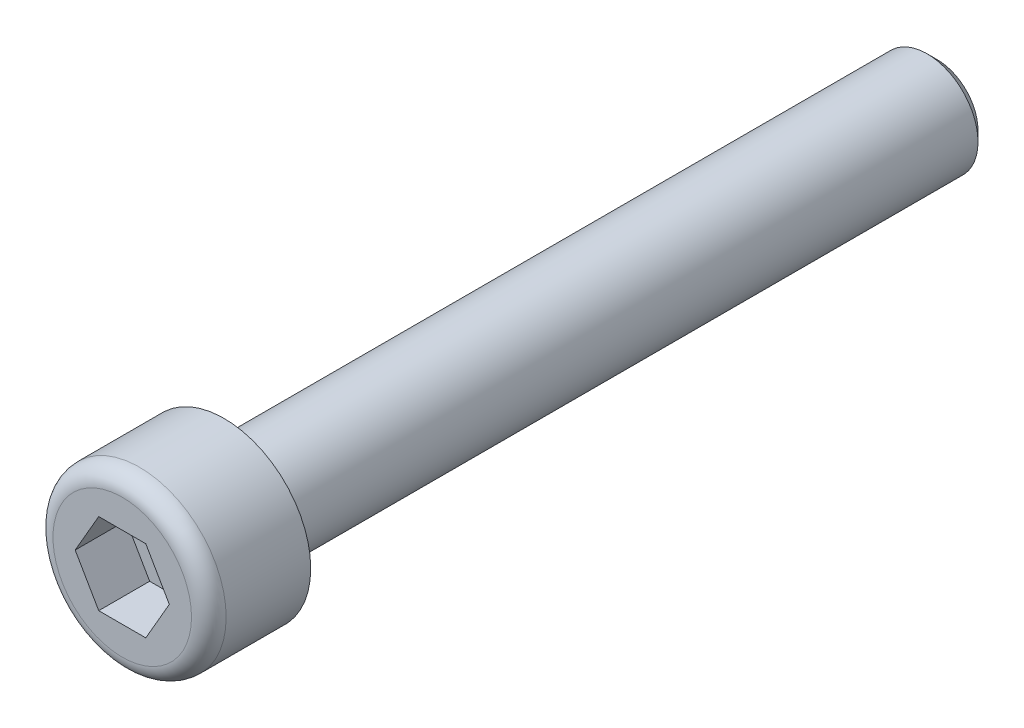
ISO-10303-21;
HEADER;
FILE_DESCRIPTION(('STEP AP214'),'2;1');
FILE_NAME('part.step','',(''),(''),'','','');
FILE_SCHEMA(('AUTOMOTIVE_DESIGN { 1 0 10303 214 1 1 1 1 }'));
ENDSEC;
DATA;
#1=APPLICATION_CONTEXT('core data for automotive mechanical design processes');
#2=APPLICATION_PROTOCOL_DEFINITION('international standard','automotive_design',2000,#1);
#3=PRODUCT_CONTEXT('',#1,'mechanical');
#4=PRODUCT('Part','Part','',(#3));
#5=PRODUCT_RELATED_PRODUCT_CATEGORY('part','',(#4));
#6=PRODUCT_DEFINITION_FORMATION('','',#4);
#7=PRODUCT_DEFINITION_CONTEXT('part definition',#1,'design');
#8=PRODUCT_DEFINITION('design','',#6,#7);
#9=PRODUCT_DEFINITION_SHAPE('','',#8);
#10=(LENGTH_UNIT() NAMED_UNIT(*) SI_UNIT(.MILLI.,.METRE.));
#11=(NAMED_UNIT(*) PLANE_ANGLE_UNIT() SI_UNIT($,.RADIAN.));
#12=(NAMED_UNIT(*) SI_UNIT($,.STERADIAN.) SOLID_ANGLE_UNIT());
#13=UNCERTAINTY_MEASURE_WITH_UNIT(LENGTH_MEASURE(1.E-05),#10,'distance_accuracy_value','');
#14=(GEOMETRIC_REPRESENTATION_CONTEXT(3) GLOBAL_UNCERTAINTY_ASSIGNED_CONTEXT((#13)) GLOBAL_UNIT_ASSIGNED_CONTEXT((#10,
#11,#12)) REPRESENTATION_CONTEXT('',''));
#15=CARTESIAN_POINT('',(0.,0.,0.));
#16=DIRECTION('',(0.,0.,1.));
#17=DIRECTION('',(1.,0.,0.));
#18=AXIS2_PLACEMENT_3D('',#15,#16,#17);
#19=CARTESIAN_POINT('',(0.,0.,2.5));
#20=DIRECTION('',(0.,0.,1.));
#21=DIRECTION('',(1.,0.,0.));
#22=AXIS2_PLACEMENT_3D('',#19,#20,#21);
#23=PLANE('',#22);
#24=DIRECTION('',(-0.50000000000019,0.866025403784329,0.));
#25=VECTOR('',#24,1.);
#26=CARTESIAN_POINT('',(2.31,0.,2.5));
#27=LINE('',#26,#25);
#28=CARTESIAN_POINT('',(2.31,0.,2.5));
#29=VERTEX_POINT('',#28);
#30=CARTESIAN_POINT('',(1.155,2.000518682742,2.5));
#31=VERTEX_POINT('',#30);
#32=EDGE_CURVE('E10',#29,#31,#27,.T.);
#33=ORIENTED_EDGE('',*,*,#32,.T.);
#34=DIRECTION('',(-1.,0.,0.));
#35=VECTOR('',#34,1.);
#36=CARTESIAN_POINT('',(1.155,2.000518682742,2.5));
#37=LINE('',#36,#35);
#38=CARTESIAN_POINT('',(-1.155,2.000518682742,2.5));
#39=VERTEX_POINT('',#38);
#40=EDGE_CURVE('E25',#31,#39,#37,.T.);
#41=ORIENTED_EDGE('',*,*,#40,.T.);
#42=DIRECTION('',(-0.50000000000019,-0.866025403784329,0.));
#43=VECTOR('',#42,1.);
#44=CARTESIAN_POINT('',(-1.155,2.000518682742,2.5));
#45=LINE('',#44,#43);
#46=CARTESIAN_POINT('',(-2.31,0.,2.5));
#47=VERTEX_POINT('',#46);
#48=EDGE_CURVE('E111',#39,#47,#45,.T.);
#49=ORIENTED_EDGE('',*,*,#48,.T.);
#50=DIRECTION('',(0.50000000000019,-0.866025403784329,0.));
#51=VECTOR('',#50,1.);
#52=CARTESIAN_POINT('',(-2.31,0.,2.5));
#53=LINE('',#52,#51);
#54=CARTESIAN_POINT('',(-1.155,-2.000518682742,2.5));
#55=VERTEX_POINT('',#54);
#56=EDGE_CURVE('E117',#47,#55,#53,.T.);
#57=ORIENTED_EDGE('',*,*,#56,.T.);
#58=DIRECTION('',(1.,0.,0.));
#59=VECTOR('',#58,1.);
#60=CARTESIAN_POINT('',(-1.155,-2.000518682742,2.5));
#61=LINE('',#60,#59);
#62=CARTESIAN_POINT('',(1.155,-2.000518682742,2.5));
#63=VERTEX_POINT('',#62);
#64=EDGE_CURVE('E161',#55,#63,#61,.T.);
#65=ORIENTED_EDGE('',*,*,#64,.T.);
#66=DIRECTION('',(0.50000000000019,0.866025403784329,0.));
#67=VECTOR('',#66,1.);
#68=CARTESIAN_POINT('',(1.155,-2.000518682742,2.5));
#69=LINE('',#68,#67);
#70=EDGE_CURVE('E154',#63,#29,#69,.T.);
#71=ORIENTED_EDGE('',*,*,#70,.T.);
#72=EDGE_LOOP('',(#33,#41,#49,#57,#65,#71));
#73=FACE_BOUND('',#72,.T.);
#74=ADVANCED_FACE('F16',(#73),#23,.T.);
#75=CARTESIAN_POINT('',(2.31,0.,2.5));
#76=DIRECTION('',(-0.866025403784329,-0.50000000000019,0.));
#77=DIRECTION('',(-0.50000000000019,0.866025403784329,0.));
#78=AXIS2_PLACEMENT_3D('',#75,#76,#77);
#79=PLANE('',#78);
#80=DIRECTION('',(0.,0.,1.));
#81=VECTOR('',#80,1.);
#82=CARTESIAN_POINT('',(2.31,0.,2.5));
#83=LINE('',#82,#81);
#84=CARTESIAN_POINT('',(2.31,0.,5.));
#85=VERTEX_POINT('',#84);
#86=EDGE_CURVE('E155',#29,#85,#83,.T.);
#87=ORIENTED_EDGE('',*,*,#86,.T.);
#88=DIRECTION('',(-0.50000000000019,0.866025403784329,0.));
#89=VECTOR('',#88,1.);
#90=CARTESIAN_POINT('',(2.31,0.,5.));
#91=LINE('',#90,#89);
#92=CARTESIAN_POINT('',(1.155,2.000518682742,5.));
#93=VERTEX_POINT('',#92);
#94=EDGE_CURVE('E126',#85,#93,#91,.T.);
#95=ORIENTED_EDGE('',*,*,#94,.T.);
#96=DIRECTION('',(0.,0.,1.));
#97=VECTOR('',#96,1.);
#98=CARTESIAN_POINT('',(1.155,2.000518682742,2.5));
#99=LINE('',#98,#97);
#100=EDGE_CURVE('E125',#31,#93,#99,.T.);
#101=ORIENTED_EDGE('',*,*,#100,.F.);
#102=ORIENTED_EDGE('',*,*,#32,.F.);
#103=EDGE_LOOP('',(#87,#95,#101,#102));
#104=FACE_BOUND('',#103,.T.);
#105=ADVANCED_FACE('F180',(#104),#79,.T.);
#106=CARTESIAN_POINT('',(1.155,2.000518682742,2.5));
#107=DIRECTION('',(0.,-1.,0.));
#108=DIRECTION('',(-1.,0.,0.));
#109=AXIS2_PLACEMENT_3D('',#106,#107,#108);
#110=PLANE('',#109);
#111=ORIENTED_EDGE('',*,*,#100,.T.);
#112=DIRECTION('',(-1.,0.,0.));
#113=VECTOR('',#112,1.);
#114=CARTESIAN_POINT('',(1.155,2.000518682742,5.));
#115=LINE('',#114,#113);
#116=CARTESIAN_POINT('',(-1.155,2.000518682742,5.));
#117=VERTEX_POINT('',#116);
#118=EDGE_CURVE('E120',#93,#117,#115,.T.);
#119=ORIENTED_EDGE('',*,*,#118,.T.);
#120=DIRECTION('',(0.,0.,1.));
#121=VECTOR('',#120,1.);
#122=CARTESIAN_POINT('',(-1.155,2.000518682742,2.5));
#123=LINE('',#122,#121);
#124=EDGE_CURVE('E110',#39,#117,#123,.T.);
#125=ORIENTED_EDGE('',*,*,#124,.F.);
#126=ORIENTED_EDGE('',*,*,#40,.F.);
#127=EDGE_LOOP('',(#111,#119,#125,#126));
#128=FACE_BOUND('',#127,.T.);
#129=ADVANCED_FACE('F18',(#128),#110,.T.);
#130=CARTESIAN_POINT('',(-1.155,2.000518682742,2.5));
#131=DIRECTION('',(0.866025403784329,-0.50000000000019,0.));
#132=DIRECTION('',(0.,0.,-1.));
#133=AXIS2_PLACEMENT_3D('',#130,#131,#132);
#134=PLANE('',#133);
#135=ORIENTED_EDGE('',*,*,#124,.T.);
#136=DIRECTION('',(-0.50000000000019,-0.866025403784329,0.));
#137=VECTOR('',#136,1.);
#138=CARTESIAN_POINT('',(-1.155,2.000518682742,5.));
#139=LINE('',#138,#137);
#140=CARTESIAN_POINT('',(-2.31,0.,5.));
#141=VERTEX_POINT('',#140);
#142=EDGE_CURVE('E115',#117,#141,#139,.T.);
#143=ORIENTED_EDGE('',*,*,#142,.T.);
#144=DIRECTION('',(0.,0.,1.));
#145=VECTOR('',#144,1.);
#146=CARTESIAN_POINT('',(-2.31,0.,2.5));
#147=LINE('',#146,#145);
#148=EDGE_CURVE('E163',#47,#141,#147,.T.);
#149=ORIENTED_EDGE('',*,*,#148,.F.);
#150=ORIENTED_EDGE('',*,*,#48,.F.);
#151=EDGE_LOOP('',(#135,#143,#149,#150));
#152=FACE_BOUND('',#151,.T.);
#153=ADVANCED_FACE('F108',(#152),#134,.T.);
#154=CARTESIAN_POINT('',(-2.31,0.,2.5));
#155=DIRECTION('',(0.866025403784329,0.50000000000019,0.));
#156=DIRECTION('',(0.,0.,-1.));
#157=AXIS2_PLACEMENT_3D('',#154,#155,#156);
#158=PLANE('',#157);
#159=ORIENTED_EDGE('',*,*,#148,.T.);
#160=DIRECTION('',(0.50000000000019,-0.866025403784329,0.));
#161=VECTOR('',#160,1.);
#162=CARTESIAN_POINT('',(-2.31,0.,5.));
#163=LINE('',#162,#161);
#164=CARTESIAN_POINT('',(-1.155,-2.000518682742,5.));
#165=VERTEX_POINT('',#164);
#166=EDGE_CURVE('E132',#141,#165,#163,.T.);
#167=ORIENTED_EDGE('',*,*,#166,.T.);
#168=DIRECTION('',(0.,0.,1.));
#169=VECTOR('',#168,1.);
#170=CARTESIAN_POINT('',(-1.155,-2.000518682742,2.5));
#171=LINE('',#170,#169);
#172=EDGE_CURVE('E158',#55,#165,#171,.T.);
#173=ORIENTED_EDGE('',*,*,#172,.F.);
#174=ORIENTED_EDGE('',*,*,#56,.F.);
#175=EDGE_LOOP('',(#159,#167,#173,#174));
#176=FACE_BOUND('',#175,.T.);
#177=ADVANCED_FACE('F206',(#176),#158,.T.);
#178=CARTESIAN_POINT('',(-1.155,-2.000518682742,2.5));
#179=DIRECTION('',(0.,1.,0.));
#180=DIRECTION('',(1.,0.,0.));
#181=AXIS2_PLACEMENT_3D('',#178,#179,#180);
#182=PLANE('',#181);
#183=ORIENTED_EDGE('',*,*,#172,.T.);
#184=DIRECTION('',(1.,0.,0.));
#185=VECTOR('',#184,1.);
#186=CARTESIAN_POINT('',(-1.155,-2.000518682742,5.));
#187=LINE('',#186,#185);
#188=CARTESIAN_POINT('',(1.155,-2.000518682742,5.));
#189=VERTEX_POINT('',#188);
#190=EDGE_CURVE('E139',#165,#189,#187,.T.);
#191=ORIENTED_EDGE('',*,*,#190,.T.);
#192=DIRECTION('',(0.,0.,1.));
#193=VECTOR('',#192,1.);
#194=CARTESIAN_POINT('',(1.155,-2.000518682742,2.5));
#195=LINE('',#194,#193);
#196=EDGE_CURVE('E149',#63,#189,#195,.T.);
#197=ORIENTED_EDGE('',*,*,#196,.F.);
#198=ORIENTED_EDGE('',*,*,#64,.F.);
#199=EDGE_LOOP('',(#183,#191,#197,#198));
#200=FACE_BOUND('',#199,.T.);
#201=ADVANCED_FACE('F211',(#200),#182,.T.);
#202=CARTESIAN_POINT('',(1.155,-2.000518682742,2.5));
#203=DIRECTION('',(-0.866025403784329,0.50000000000019,0.));
#204=DIRECTION('',(0.,0.,1.));
#205=AXIS2_PLACEMENT_3D('',#202,#203,#204);
#206=PLANE('',#205);
#207=ORIENTED_EDGE('',*,*,#196,.T.);
#208=DIRECTION('',(0.50000000000019,0.866025403784329,0.));
#209=VECTOR('',#208,1.);
#210=CARTESIAN_POINT('',(1.155,-2.000518682742,5.));
#211=LINE('',#210,#209);
#212=EDGE_CURVE('E144',#189,#85,#211,.T.);
#213=ORIENTED_EDGE('',*,*,#212,.T.);
#214=ORIENTED_EDGE('',*,*,#86,.F.);
#215=ORIENTED_EDGE('',*,*,#70,.F.);
#216=EDGE_LOOP('',(#207,#213,#214,#215));
#217=FACE_BOUND('',#216,.T.);
#218=ADVANCED_FACE('F232',(#217),#206,.T.);
#219=CARTESIAN_POINT('',(0.,0.,5.));
#220=DIRECTION('',(0.,0.,1.));
#221=DIRECTION('',(1.,0.,0.));
#222=AXIS2_PLACEMENT_3D('',#219,#220,#221);
#223=PLANE('',#222);
#224=ORIENTED_EDGE('',*,*,#190,.F.);
#225=ORIENTED_EDGE('',*,*,#166,.F.);
#226=ORIENTED_EDGE('',*,*,#142,.F.);
#227=ORIENTED_EDGE('',*,*,#118,.F.);
#228=ORIENTED_EDGE('',*,*,#94,.F.);
#229=ORIENTED_EDGE('',*,*,#212,.F.);
#230=EDGE_LOOP('',(#224,#225,#226,#227,#228,#229));
#231=FACE_BOUND('',#230,.T.);
#232=CARTESIAN_POINT('',(0.,0.,5.));
#233=DIRECTION('',(0.,0.,1.));
#234=DIRECTION('',(1.,0.,0.));
#235=AXIS2_PLACEMENT_3D('',#232,#233,#234);
#236=CIRCLE('',#235,3.4);
#237=CARTESIAN_POINT('',(3.4,0.,5.));
#238=VERTEX_POINT('',#237);
#239=EDGE_CURVE('E353',#238,#238,#236,.T.);
#240=ORIENTED_EDGE('',*,*,#239,.T.);
#241=EDGE_LOOP('',(#240));
#242=FACE_BOUND('',#241,.T.);
#243=ADVANCED_FACE('F129',(#231,#242),#223,.T.);
#244=CARTESIAN_POINT('',(0.,0.,4.15));
#245=DIRECTION('',(0.,0.,1.));
#246=DIRECTION('',(1.,0.,0.));
#247=AXIS2_PLACEMENT_3D('',#244,#245,#246);
#248=TOROIDAL_SURFACE('',#247,3.4,0.85);
#249=CARTESIAN_POINT('',(0.,0.,4.15));
#250=DIRECTION('',(0.,0.,1.));
#251=DIRECTION('',(1.,0.,0.));
#252=AXIS2_PLACEMENT_3D('',#249,#250,#251);
#253=CIRCLE('',#252,4.25);
#254=CARTESIAN_POINT('',(4.25,0.,4.15));
#255=VERTEX_POINT('',#254);
#256=EDGE_CURVE('E342',#255,#255,#253,.T.);
#257=ORIENTED_EDGE('',*,*,#256,.T.);
#258=CARTESIAN_POINT('',(3.4,0.,4.15));
#259=DIRECTION('',(0.,-1.,0.));
#260=DIRECTION('',(1.,0.,0.));
#261=AXIS2_PLACEMENT_3D('',#258,#259,#260);
#262=CIRCLE('',#261,0.85);
#263=EDGE_CURVE('E350',#255,#238,#262,.T.);
#264=ORIENTED_EDGE('',*,*,#263,.T.);
#265=ORIENTED_EDGE('',*,*,#239,.F.);
#266=ORIENTED_EDGE('',*,*,#263,.F.);
#267=EDGE_LOOP('',(#257,#264,#265,#266));
#268=FACE_BOUND('',#267,.T.);
#269=ADVANCED_FACE('F285',(#268),#248,.T.);
#270=CARTESIAN_POINT('',(0.,0.,0.));
#271=DIRECTION('',(0.,0.,1.));
#272=DIRECTION('',(1.,0.,0.));
#273=AXIS2_PLACEMENT_3D('',#270,#271,#272);
#274=CYLINDRICAL_SURFACE('',#273,4.25);
#275=CARTESIAN_POINT('',(0.,0.,0.));
#276=DIRECTION('',(0.,0.,1.));
#277=DIRECTION('',(1.,0.,0.));
#278=AXIS2_PLACEMENT_3D('',#275,#276,#277);
#279=CIRCLE('',#278,4.25);
#280=CARTESIAN_POINT('',(4.25,0.,0.));
#281=VERTEX_POINT('',#280);
#282=EDGE_CURVE('E360',#281,#281,#279,.T.);
#283=ORIENTED_EDGE('',*,*,#282,.T.);
#284=DIRECTION('',(0.,0.,1.));
#285=VECTOR('',#284,1.);
#286=CARTESIAN_POINT('',(4.25,0.,0.));
#287=LINE('',#286,#285);
#288=EDGE_CURVE('E347',#281,#255,#287,.T.);
#289=ORIENTED_EDGE('',*,*,#288,.T.);
#290=ORIENTED_EDGE('',*,*,#256,.F.);
#291=ORIENTED_EDGE('',*,*,#288,.F.);
#292=EDGE_LOOP('',(#283,#289,#290,#291));
#293=FACE_BOUND('',#292,.T.);
#294=ADVANCED_FACE('F273',(#293),#274,.T.);
#295=CARTESIAN_POINT('',(0.,0.,0.));
#296=DIRECTION('',(0.,0.,1.));
#297=DIRECTION('',(1.,0.,0.));
#298=AXIS2_PLACEMENT_3D('',#295,#296,#297);
#299=PLANE('',#298);
#300=ORIENTED_EDGE('',*,*,#282,.F.);
#301=EDGE_LOOP('',(#300));
#302=FACE_BOUND('',#301,.T.);
#303=CARTESIAN_POINT('',(0.,0.,0.));
#304=DIRECTION('',(0.,0.,1.));
#305=DIRECTION('',(1.,0.,0.));
#306=AXIS2_PLACEMENT_3D('',#303,#304,#305);
#307=CIRCLE('',#306,2.5);
#308=CARTESIAN_POINT('',(2.5,0.,0.));
#309=VERTEX_POINT('',#308);
#310=EDGE_CURVE('E383',#309,#309,#307,.T.);
#311=ORIENTED_EDGE('',*,*,#310,.T.);
#312=EDGE_LOOP('',(#311));
#313=FACE_BOUND('',#312,.T.);
#314=ADVANCED_FACE('F244',(#302,#313),#299,.F.);
#315=CARTESIAN_POINT('',(0.,0.,-34.5));
#316=DIRECTION('',(0.,0.,1.));
#317=DIRECTION('',(1.,0.,0.));
#318=AXIS2_PLACEMENT_3D('',#315,#316,#317);
#319=CYLINDRICAL_SURFACE('',#318,2.5);
#320=CARTESIAN_POINT('',(0.,0.,-34.5));
#321=DIRECTION('',(0.,0.,1.));
#322=DIRECTION('',(1.,0.,0.));
#323=AXIS2_PLACEMENT_3D('',#320,#321,#322);
#324=CIRCLE('',#323,2.5);
#325=CARTESIAN_POINT('',(2.5,0.,-34.5));
#326=VERTEX_POINT('',#325);
#327=EDGE_CURVE('E379',#326,#326,#324,.T.);
#328=ORIENTED_EDGE('',*,*,#327,.T.);
#329=DIRECTION('',(0.,0.,1.));
#330=VECTOR('',#329,1.);
#331=CARTESIAN_POINT('',(2.5,0.,-34.5));
#332=LINE('',#331,#330);
#333=EDGE_CURVE('E385',#326,#309,#332,.T.);
#334=ORIENTED_EDGE('',*,*,#333,.T.);
#335=ORIENTED_EDGE('',*,*,#310,.F.);
#336=ORIENTED_EDGE('',*,*,#333,.F.);
#337=EDGE_LOOP('',(#328,#334,#335,#336));
#338=FACE_BOUND('',#337,.T.);
#339=ADVANCED_FACE('F224',(#338),#319,.T.);
#340=CARTESIAN_POINT('',(0.,0.,-35.));
#341=DIRECTION('',(0.,0.,1.));
#342=DIRECTION('',(1.,0.,0.));
#343=AXIS2_PLACEMENT_3D('',#340,#341,#342);
#344=CONICAL_SURFACE('',#343,2.,0.785398163404999);
#345=CARTESIAN_POINT('',(0.,0.,-35.));
#346=DIRECTION('',(0.,0.,1.));
#347=DIRECTION('',(1.,0.,0.));
#348=AXIS2_PLACEMENT_3D('',#345,#346,#347);
#349=CIRCLE('',#348,2.);
#350=CARTESIAN_POINT('',(2.,0.,-35.));
#351=VERTEX_POINT('',#350);
#352=EDGE_CURVE('E398',#351,#351,#349,.T.);
#353=ORIENTED_EDGE('',*,*,#352,.T.);
#354=DIRECTION('',(0.707106781192048,0.,0.707106781181048));
#355=VECTOR('',#354,1.);
#356=CARTESIAN_POINT('',(2.,0.,-35.));
#357=LINE('',#356,#355);
#358=EDGE_CURVE('E395',#351,#326,#357,.T.);
#359=ORIENTED_EDGE('',*,*,#358,.T.);
#360=ORIENTED_EDGE('',*,*,#327,.F.);
#361=ORIENTED_EDGE('',*,*,#358,.F.);
#362=EDGE_LOOP('',(#353,#359,#360,#361));
#363=FACE_BOUND('',#362,.T.);
#364=ADVANCED_FACE('F196',(#363),#344,.T.);
#365=CARTESIAN_POINT('',(0.,0.,-35.));
#366=DIRECTION('',(0.,0.,1.));
#367=DIRECTION('',(1.,0.,0.));
#368=AXIS2_PLACEMENT_3D('',#365,#366,#367);
#369=PLANE('',#368);
#370=ORIENTED_EDGE('',*,*,#352,.F.);
#371=EDGE_LOOP('',(#370));
#372=FACE_BOUND('',#371,.T.);
#373=ADVANCED_FACE('F193',(#372),#369,.F.);
#374=CLOSED_SHELL('',(#74,#105,#129,#153,#177,#201,#218,#243,#269,#294,#314,#339,#364,#373));
#375=MANIFOLD_SOLID_BREP('B1',#374);
#376=ADVANCED_BREP_SHAPE_REPRESENTATION('',(#18,#375),#14);
#377=SHAPE_DEFINITION_REPRESENTATION(#9,#376);
ENDSEC;
END-ISO-10303-21;
